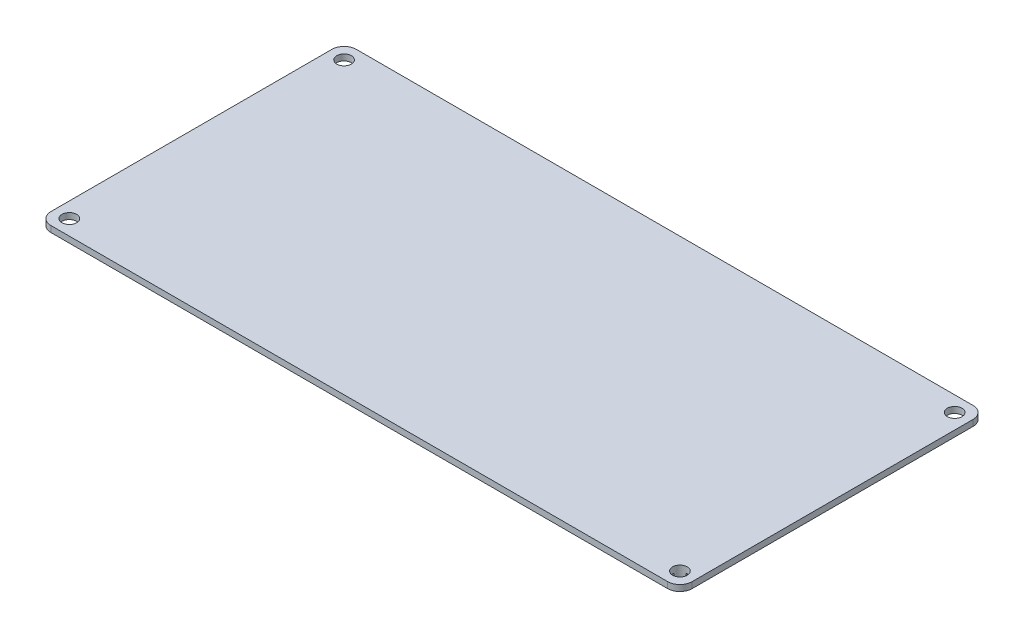
ISO-10303-21;
HEADER;
FILE_DESCRIPTION(('STEP AP214'),'2;1');
FILE_NAME('part.step','',(''),(''),'','','');
FILE_SCHEMA(('AUTOMOTIVE_DESIGN { 1 0 10303 214 1 1 1 1 }'));
ENDSEC;
DATA;
#1=APPLICATION_CONTEXT('core data for automotive mechanical design processes');
#2=APPLICATION_PROTOCOL_DEFINITION('international standard','automotive_design',2000,#1);
#3=PRODUCT_CONTEXT('',#1,'mechanical');
#4=PRODUCT('Part','Part','',(#3));
#5=PRODUCT_RELATED_PRODUCT_CATEGORY('part','',(#4));
#6=PRODUCT_DEFINITION_FORMATION('','',#4);
#7=PRODUCT_DEFINITION_CONTEXT('part definition',#1,'design');
#8=PRODUCT_DEFINITION('design','',#6,#7);
#9=PRODUCT_DEFINITION_SHAPE('','',#8);
#10=(LENGTH_UNIT() NAMED_UNIT(*) SI_UNIT(.MILLI.,.METRE.));
#11=(NAMED_UNIT(*) PLANE_ANGLE_UNIT() SI_UNIT($,.RADIAN.));
#12=(NAMED_UNIT(*) SI_UNIT($,.STERADIAN.) SOLID_ANGLE_UNIT());
#13=UNCERTAINTY_MEASURE_WITH_UNIT(LENGTH_MEASURE(1.E-05),#10,'distance_accuracy_value','');
#14=(GEOMETRIC_REPRESENTATION_CONTEXT(3) GLOBAL_UNCERTAINTY_ASSIGNED_CONTEXT((#13)) GLOBAL_UNIT_ASSIGNED_CONTEXT((#10,
#11,#12)) REPRESENTATION_CONTEXT('',''));
#15=CARTESIAN_POINT('',(0.,0.,0.));
#16=DIRECTION('',(0.,0.,1.));
#17=DIRECTION('',(1.,0.,0.));
#18=AXIS2_PLACEMENT_3D('',#15,#16,#17);
#19=CARTESIAN_POINT('',(0.,0.,0.));
#20=DIRECTION('',(0.,1.,0.));
#21=DIRECTION('',(0.,0.,1.));
#22=AXIS2_PLACEMENT_3D('',#19,#20,#21);
#23=PLANE('',#22);
#24=DIRECTION('',(0.,0.,1.));
#25=VECTOR('',#24,1.);
#26=CARTESIAN_POINT('',(63.2714,0.,28.3464));
#27=LINE('',#26,#25);
#28=CARTESIAN_POINT('',(63.2714,0.,-27.0682425410837));
#29=VERTEX_POINT('',#28);
#30=CARTESIAN_POINT('',(63.2714,0.,27.0682425410837));
#31=VERTEX_POINT('',#30);
#32=EDGE_CURVE('E321',#29,#31,#27,.T.);
#33=ORIENTED_EDGE('',*,*,#32,.T.);
#34=CARTESIAN_POINT('',(63.5,0.,28.575));
#35=DIRECTION('',(0.,-1.,0.));
#36=DIRECTION('',(0.,0.,-1.));
#37=AXIS2_PLACEMENT_3D('',#34,#35,#36);
#38=CIRCLE('',#37,1.524);
#39=CARTESIAN_POINT('',(61.9932425410837,0.,28.3464));
#40=VERTEX_POINT('',#39);
#41=EDGE_CURVE('E198',#40,#31,#38,.T.);
#42=ORIENTED_EDGE('',*,*,#41,.F.);
#43=DIRECTION('',(-1.,0.,0.));
#44=VECTOR('',#43,1.);
#45=CARTESIAN_POINT('',(-63.2714,0.,28.3464));
#46=LINE('',#45,#44);
#47=CARTESIAN_POINT('',(-61.9932425410837,0.,28.3464));
#48=VERTEX_POINT('',#47);
#49=EDGE_CURVE('E171',#40,#48,#46,.T.);
#50=ORIENTED_EDGE('',*,*,#49,.T.);
#51=CARTESIAN_POINT('',(-63.5,0.,28.575));
#52=DIRECTION('',(0.,-1.,0.));
#53=DIRECTION('',(0.,0.,-1.));
#54=AXIS2_PLACEMENT_3D('',#51,#52,#53);
#55=CIRCLE('',#54,1.52399999999999);
#56=CARTESIAN_POINT('',(-63.2714,0.,27.0682425410837));
#57=VERTEX_POINT('',#56);
#58=EDGE_CURVE('E197',#57,#48,#55,.T.);
#59=ORIENTED_EDGE('',*,*,#58,.F.);
#60=DIRECTION('',(0.,0.,-1.));
#61=VECTOR('',#60,1.);
#62=CARTESIAN_POINT('',(-63.2714,0.,28.3464));
#63=LINE('',#62,#61);
#64=CARTESIAN_POINT('',(-63.2714,0.,-27.0682425410837));
#65=VERTEX_POINT('',#64);
#66=EDGE_CURVE('E328',#57,#65,#63,.T.);
#67=ORIENTED_EDGE('',*,*,#66,.T.);
#68=CARTESIAN_POINT('',(-63.5,0.,-28.575));
#69=DIRECTION('',(0.,-1.,0.));
#70=DIRECTION('',(0.,0.,-1.));
#71=AXIS2_PLACEMENT_3D('',#68,#69,#70);
#72=CIRCLE('',#71,1.52399999999999);
#73=CARTESIAN_POINT('',(-61.9932425410837,0.,-28.3464));
#74=VERTEX_POINT('',#73);
#75=EDGE_CURVE('E192',#74,#65,#72,.T.);
#76=ORIENTED_EDGE('',*,*,#75,.F.);
#77=DIRECTION('',(1.,0.,0.));
#78=VECTOR('',#77,1.);
#79=CARTESIAN_POINT('',(-63.2714,0.,-28.3464));
#80=LINE('',#79,#78);
#81=CARTESIAN_POINT('',(61.9932425410837,0.,-28.3464));
#82=VERTEX_POINT('',#81);
#83=EDGE_CURVE('E325',#74,#82,#80,.T.);
#84=ORIENTED_EDGE('',*,*,#83,.T.);
#85=CARTESIAN_POINT('',(63.5,0.,-28.575));
#86=DIRECTION('',(0.,-1.,0.));
#87=DIRECTION('',(0.,0.,-1.));
#88=AXIS2_PLACEMENT_3D('',#85,#86,#87);
#89=CIRCLE('',#88,1.524);
#90=EDGE_CURVE('E176',#29,#82,#89,.T.);
#91=ORIENTED_EDGE('',*,*,#90,.F.);
#92=EDGE_LOOP('',(#33,#42,#50,#59,#67,#76,#84,#91));
#93=FACE_BOUND('',#92,.T.);
#94=ADVANCED_FACE('F39',(#93),#23,.F.);
#95=CARTESIAN_POINT('',(-63.5,2.54,28.575));
#96=DIRECTION('',(0.,-1.,0.));
#97=DIRECTION('',(0.,0.,-1.));
#98=AXIS2_PLACEMENT_3D('',#95,#96,#97);
#99=CYLINDRICAL_SURFACE('',#98,1.52399999999999);
#100=CARTESIAN_POINT('',(-63.5,2.54,28.575));
#101=DIRECTION('',(0.,-1.,0.));
#102=DIRECTION('',(0.,0.,-1.));
#103=AXIS2_PLACEMENT_3D('',#100,#101,#102);
#104=CIRCLE('',#103,1.52399999999999);
#105=CARTESIAN_POINT('',(-63.5,2.54,27.051));
#106=VERTEX_POINT('',#105);
#107=EDGE_CURVE('E215',#106,#106,#104,.T.);
#108=ORIENTED_EDGE('',*,*,#107,.F.);
#109=EDGE_LOOP('',(#108));
#110=FACE_BOUND('',#109,.T.);
#111=DIRECTION('',(0.,-1.,0.));
#112=VECTOR('',#111,1.);
#113=CARTESIAN_POINT('',(-63.2714,2.54,27.0682425410837));
#114=LINE('',#113,#112);
#115=CARTESIAN_POINT('',(-63.2714,1.27,27.0682425410837));
#116=VERTEX_POINT('',#115);
#117=EDGE_CURVE('E179',#57,#116,#114,.F.);
#118=ORIENTED_EDGE('',*,*,#117,.F.);
#119=ORIENTED_EDGE('',*,*,#58,.T.);
#120=DIRECTION('',(0.,-1.,0.));
#121=VECTOR('',#120,1.);
#122=CARTESIAN_POINT('',(-61.9932425410837,2.54,28.3464));
#123=LINE('',#122,#121);
#124=CARTESIAN_POINT('',(-61.9932425410837,1.27,28.3464));
#125=VERTEX_POINT('',#124);
#126=EDGE_CURVE('E183',#125,#48,#123,.T.);
#127=ORIENTED_EDGE('',*,*,#126,.F.);
#128=CARTESIAN_POINT('',(-63.5,1.27,28.575));
#129=DIRECTION('',(0.,1.,0.));
#130=DIRECTION('',(0.,0.,1.));
#131=AXIS2_PLACEMENT_3D('',#128,#129,#130);
#132=CIRCLE('',#131,1.52399999999999);
#133=EDGE_CURVE('E219',#116,#125,#132,.T.);
#134=ORIENTED_EDGE('',*,*,#133,.F.);
#135=EDGE_LOOP('',(#118,#119,#127,#134));
#136=FACE_BOUND('',#135,.T.);
#137=ADVANCED_FACE('F350',(#110,#136),#99,.F.);
#138=CARTESIAN_POINT('',(63.5,2.54,28.575));
#139=DIRECTION('',(0.,-1.,0.));
#140=DIRECTION('',(0.,0.,-1.));
#141=AXIS2_PLACEMENT_3D('',#138,#139,#140);
#142=CYLINDRICAL_SURFACE('',#141,1.524);
#143=CARTESIAN_POINT('',(63.5,2.54,28.575));
#144=DIRECTION('',(0.,-1.,0.));
#145=DIRECTION('',(0.,0.,-1.));
#146=AXIS2_PLACEMENT_3D('',#143,#144,#145);
#147=CIRCLE('',#146,1.524);
#148=CARTESIAN_POINT('',(63.5,2.54,27.051));
#149=VERTEX_POINT('',#148);
#150=EDGE_CURVE('E193',#149,#149,#147,.T.);
#151=ORIENTED_EDGE('',*,*,#150,.F.);
#152=EDGE_LOOP('',(#151));
#153=FACE_BOUND('',#152,.T.);
#154=DIRECTION('',(0.,-1.,0.));
#155=VECTOR('',#154,1.);
#156=CARTESIAN_POINT('',(61.9932425410837,2.54,28.3464));
#157=LINE('',#156,#155);
#158=CARTESIAN_POINT('',(61.9932425410837,1.27,28.3464));
#159=VERTEX_POINT('',#158);
#160=EDGE_CURVE('E11',#40,#159,#157,.F.);
#161=ORIENTED_EDGE('',*,*,#160,.F.);
#162=ORIENTED_EDGE('',*,*,#41,.T.);
#163=DIRECTION('',(0.,-1.,0.));
#164=VECTOR('',#163,1.);
#165=CARTESIAN_POINT('',(63.2714,2.54,27.0682425410837));
#166=LINE('',#165,#164);
#167=CARTESIAN_POINT('',(63.2714,1.27,27.0682425410837));
#168=VERTEX_POINT('',#167);
#169=EDGE_CURVE('E178',#168,#31,#166,.T.);
#170=ORIENTED_EDGE('',*,*,#169,.F.);
#171=CARTESIAN_POINT('',(63.5,1.27,28.575));
#172=DIRECTION('',(0.,1.,0.));
#173=DIRECTION('',(0.,0.,1.));
#174=AXIS2_PLACEMENT_3D('',#171,#172,#173);
#175=CIRCLE('',#174,1.524);
#176=EDGE_CURVE('E55',#159,#168,#175,.T.);
#177=ORIENTED_EDGE('',*,*,#176,.F.);
#178=EDGE_LOOP('',(#161,#162,#170,#177));
#179=FACE_BOUND('',#178,.T.);
#180=ADVANCED_FACE('F352',(#153,#179),#142,.F.);
#181=CARTESIAN_POINT('',(63.5,2.54,-28.575));
#182=DIRECTION('',(0.,-1.,0.));
#183=DIRECTION('',(0.,0.,-1.));
#184=AXIS2_PLACEMENT_3D('',#181,#182,#183);
#185=CYLINDRICAL_SURFACE('',#184,1.524);
#186=CARTESIAN_POINT('',(63.5,2.54,-28.575));
#187=DIRECTION('',(0.,-1.,0.));
#188=DIRECTION('',(0.,0.,-1.));
#189=AXIS2_PLACEMENT_3D('',#186,#187,#188);
#190=CIRCLE('',#189,1.524);
#191=CARTESIAN_POINT('',(63.5,2.54,-30.099));
#192=VERTEX_POINT('',#191);
#193=EDGE_CURVE('E202',#192,#192,#190,.T.);
#194=ORIENTED_EDGE('',*,*,#193,.F.);
#195=EDGE_LOOP('',(#194));
#196=FACE_BOUND('',#195,.T.);
#197=DIRECTION('',(0.,-1.,0.));
#198=VECTOR('',#197,1.);
#199=CARTESIAN_POINT('',(63.2714,2.54,-27.0682425410837));
#200=LINE('',#199,#198);
#201=CARTESIAN_POINT('',(63.2714,1.27,-27.0682425410837));
#202=VERTEX_POINT('',#201);
#203=EDGE_CURVE('E48',#29,#202,#200,.F.);
#204=ORIENTED_EDGE('',*,*,#203,.F.);
#205=ORIENTED_EDGE('',*,*,#90,.T.);
#206=DIRECTION('',(0.,-1.,0.));
#207=VECTOR('',#206,1.);
#208=CARTESIAN_POINT('',(61.9932425410837,2.54,-28.3464));
#209=LINE('',#208,#207);
#210=CARTESIAN_POINT('',(61.9932425410837,1.27,-28.3464));
#211=VERTEX_POINT('',#210);
#212=EDGE_CURVE('E166',#211,#82,#209,.T.);
#213=ORIENTED_EDGE('',*,*,#212,.F.);
#214=CARTESIAN_POINT('',(63.5,1.27,-28.575));
#215=DIRECTION('',(0.,1.,0.));
#216=DIRECTION('',(0.,0.,1.));
#217=AXIS2_PLACEMENT_3D('',#214,#215,#216);
#218=CIRCLE('',#217,1.524);
#219=EDGE_CURVE('E63',#202,#211,#218,.T.);
#220=ORIENTED_EDGE('',*,*,#219,.F.);
#221=EDGE_LOOP('',(#204,#205,#213,#220));
#222=FACE_BOUND('',#221,.T.);
#223=ADVANCED_FACE('F174',(#196,#222),#185,.F.);
#224=CARTESIAN_POINT('',(-63.5,2.54,-28.575));
#225=DIRECTION('',(0.,-1.,0.));
#226=DIRECTION('',(0.,0.,-1.));
#227=AXIS2_PLACEMENT_3D('',#224,#225,#226);
#228=CYLINDRICAL_SURFACE('',#227,1.52399999999999);
#229=CARTESIAN_POINT('',(-63.5,2.54,-28.575));
#230=DIRECTION('',(0.,-1.,0.));
#231=DIRECTION('',(0.,0.,-1.));
#232=AXIS2_PLACEMENT_3D('',#229,#230,#231);
#233=CIRCLE('',#232,1.52399999999999);
#234=CARTESIAN_POINT('',(-63.5,2.54,-30.099));
#235=VERTEX_POINT('',#234);
#236=EDGE_CURVE('E208',#235,#235,#233,.T.);
#237=ORIENTED_EDGE('',*,*,#236,.F.);
#238=EDGE_LOOP('',(#237));
#239=FACE_BOUND('',#238,.T.);
#240=DIRECTION('',(0.,-1.,0.));
#241=VECTOR('',#240,1.);
#242=CARTESIAN_POINT('',(-61.9932425410837,2.54,-28.3464));
#243=LINE('',#242,#241);
#244=CARTESIAN_POINT('',(-61.9932425410837,1.27,-28.3464));
#245=VERTEX_POINT('',#244);
#246=EDGE_CURVE('E169',#74,#245,#243,.F.);
#247=ORIENTED_EDGE('',*,*,#246,.F.);
#248=ORIENTED_EDGE('',*,*,#75,.T.);
#249=DIRECTION('',(0.,-1.,0.));
#250=VECTOR('',#249,1.);
#251=CARTESIAN_POINT('',(-63.2714,2.54,-27.0682425410837));
#252=LINE('',#251,#250);
#253=CARTESIAN_POINT('',(-63.2714,1.27,-27.0682425410837));
#254=VERTEX_POINT('',#253);
#255=EDGE_CURVE('E313',#254,#65,#252,.T.);
#256=ORIENTED_EDGE('',*,*,#255,.F.);
#257=CARTESIAN_POINT('',(-63.5,1.27,-28.575));
#258=DIRECTION('',(0.,1.,0.));
#259=DIRECTION('',(0.,0.,1.));
#260=AXIS2_PLACEMENT_3D('',#257,#258,#259);
#261=CIRCLE('',#260,1.52399999999999);
#262=EDGE_CURVE('E162',#245,#254,#261,.T.);
#263=ORIENTED_EDGE('',*,*,#262,.F.);
#264=EDGE_LOOP('',(#247,#248,#256,#263));
#265=FACE_BOUND('',#264,.T.);
#266=ADVANCED_FACE('F360',(#239,#265),#228,.F.);
#267=CARTESIAN_POINT('',(0.,1.27,0.));
#268=DIRECTION('',(0.,1.,0.));
#269=DIRECTION('',(0.,0.,1.));
#270=AXIS2_PLACEMENT_3D('',#267,#268,#269);
#271=PLANE('',#270);
#272=DIRECTION('',(1.,0.,0.));
#273=VECTOR('',#272,1.);
#274=CARTESIAN_POINT('',(-66.675,1.27,31.75));
#275=LINE('',#274,#273);
#276=CARTESIAN_POINT('',(-64.135,1.27,31.75));
#277=VERTEX_POINT('',#276);
#278=CARTESIAN_POINT('',(64.135,1.27,31.75));
#279=VERTEX_POINT('',#278);
#280=EDGE_CURVE('E235',#277,#279,#275,.T.);
#281=ORIENTED_EDGE('',*,*,#280,.F.);
#282=CARTESIAN_POINT('',(-64.135,1.27,29.21));
#283=DIRECTION('',(0.,1.,0.));
#284=DIRECTION('',(0.,0.,1.));
#285=AXIS2_PLACEMENT_3D('',#282,#283,#284);
#286=CIRCLE('',#285,2.54);
#287=CARTESIAN_POINT('',(-66.675,1.27,29.21));
#288=VERTEX_POINT('',#287);
#289=EDGE_CURVE('E277',#277,#288,#286,.F.);
#290=ORIENTED_EDGE('',*,*,#289,.T.);
#291=DIRECTION('',(0.,0.,1.));
#292=VECTOR('',#291,1.);
#293=CARTESIAN_POINT('',(-66.675,1.27,-31.75));
#294=LINE('',#293,#292);
#295=CARTESIAN_POINT('',(-66.675,1.27,-29.21));
#296=VERTEX_POINT('',#295);
#297=EDGE_CURVE('E255',#296,#288,#294,.T.);
#298=ORIENTED_EDGE('',*,*,#297,.F.);
#299=CARTESIAN_POINT('',(-64.135,1.27,-29.21));
#300=DIRECTION('',(0.,1.,0.));
#301=DIRECTION('',(0.,0.,1.));
#302=AXIS2_PLACEMENT_3D('',#299,#300,#301);
#303=CIRCLE('',#302,2.54);
#304=CARTESIAN_POINT('',(-64.135,1.27,-31.75));
#305=VERTEX_POINT('',#304);
#306=EDGE_CURVE('E274',#296,#305,#303,.F.);
#307=ORIENTED_EDGE('',*,*,#306,.T.);
#308=DIRECTION('',(-1.,0.,0.));
#309=VECTOR('',#308,1.);
#310=CARTESIAN_POINT('',(-66.675,1.27,-31.75));
#311=LINE('',#310,#309);
#312=CARTESIAN_POINT('',(64.135,1.27,-31.75));
#313=VERTEX_POINT('',#312);
#314=EDGE_CURVE('E251',#313,#305,#311,.T.);
#315=ORIENTED_EDGE('',*,*,#314,.F.);
#316=CARTESIAN_POINT('',(64.135,1.27,-29.21));
#317=DIRECTION('',(0.,1.,0.));
#318=DIRECTION('',(0.,0.,1.));
#319=AXIS2_PLACEMENT_3D('',#316,#317,#318);
#320=CIRCLE('',#319,2.54);
#321=CARTESIAN_POINT('',(66.675,1.27,-29.21));
#322=VERTEX_POINT('',#321);
#323=EDGE_CURVE('E271',#313,#322,#320,.F.);
#324=ORIENTED_EDGE('',*,*,#323,.T.);
#325=DIRECTION('',(0.,0.,-1.));
#326=VECTOR('',#325,1.);
#327=CARTESIAN_POINT('',(66.675,1.27,-31.75));
#328=LINE('',#327,#326);
#329=CARTESIAN_POINT('',(66.675,1.27,29.21));
#330=VERTEX_POINT('',#329);
#331=EDGE_CURVE('E229',#330,#322,#328,.T.);
#332=ORIENTED_EDGE('',*,*,#331,.F.);
#333=CARTESIAN_POINT('',(64.135,1.27,29.21));
#334=DIRECTION('',(0.,1.,0.));
#335=DIRECTION('',(0.,0.,1.));
#336=AXIS2_PLACEMENT_3D('',#333,#334,#335);
#337=CIRCLE('',#336,2.54);
#338=EDGE_CURVE('E268',#330,#279,#337,.F.);
#339=ORIENTED_EDGE('',*,*,#338,.T.);
#340=EDGE_LOOP('',(#281,#290,#298,#307,#315,#324,#332,#339));
#341=FACE_BOUND('',#340,.T.);
#342=ORIENTED_EDGE('',*,*,#219,.T.);
#343=DIRECTION('',(1.,0.,0.));
#344=VECTOR('',#343,1.);
#345=CARTESIAN_POINT('',(-63.2714,1.26999999999999,-28.3464));
#346=LINE('',#345,#344);
#347=EDGE_CURVE('E156',#245,#211,#346,.T.);
#348=ORIENTED_EDGE('',*,*,#347,.F.);
#349=ORIENTED_EDGE('',*,*,#262,.T.);
#350=DIRECTION('',(0.,0.,-1.));
#351=VECTOR('',#350,1.);
#352=CARTESIAN_POINT('',(-63.2714,1.26999999999999,28.3464));
#353=LINE('',#352,#351);
#354=EDGE_CURVE('E186',#116,#254,#353,.T.);
#355=ORIENTED_EDGE('',*,*,#354,.F.);
#356=ORIENTED_EDGE('',*,*,#133,.T.);
#357=DIRECTION('',(-1.,0.,0.));
#358=VECTOR('',#357,1.);
#359=CARTESIAN_POINT('',(-63.2714,1.26999999999999,28.3464));
#360=LINE('',#359,#358);
#361=EDGE_CURVE('E339',#159,#125,#360,.T.);
#362=ORIENTED_EDGE('',*,*,#361,.F.);
#363=ORIENTED_EDGE('',*,*,#176,.T.);
#364=DIRECTION('',(0.,0.,1.));
#365=VECTOR('',#364,1.);
#366=CARTESIAN_POINT('',(63.2714,1.26999999999999,28.3464));
#367=LINE('',#366,#365);
#368=EDGE_CURVE('E159',#202,#168,#367,.T.);
#369=ORIENTED_EDGE('',*,*,#368,.F.);
#370=EDGE_LOOP('',(#342,#348,#349,#355,#356,#362,#363,#369));
#371=FACE_BOUND('',#370,.T.);
#372=ADVANCED_FACE('F155',(#341,#371),#271,.F.);
#373=CARTESIAN_POINT('',(66.675,2.54,-31.75));
#374=DIRECTION('',(-1.,0.,0.));
#375=DIRECTION('',(0.,0.,1.));
#376=AXIS2_PLACEMENT_3D('',#373,#374,#375);
#377=PLANE('',#376);
#378=ORIENTED_EDGE('',*,*,#331,.T.);
#379=DIRECTION('',(0.,-1.,0.));
#380=VECTOR('',#379,1.);
#381=CARTESIAN_POINT('',(66.675,2.54,-29.21));
#382=LINE('',#381,#380);
#383=CARTESIAN_POINT('',(66.675,2.54,-29.21));
#384=VERTEX_POINT('',#383);
#385=EDGE_CURVE('E310',#322,#384,#382,.F.);
#386=ORIENTED_EDGE('',*,*,#385,.T.);
#387=DIRECTION('',(0.,0.,-1.));
#388=VECTOR('',#387,1.);
#389=CARTESIAN_POINT('',(66.675,2.54,-31.75));
#390=LINE('',#389,#388);
#391=CARTESIAN_POINT('',(66.675,2.54,29.21));
#392=VERTEX_POINT('',#391);
#393=EDGE_CURVE('E230',#392,#384,#390,.T.);
#394=ORIENTED_EDGE('',*,*,#393,.F.);
#395=DIRECTION('',(0.,-1.,0.));
#396=VECTOR('',#395,1.);
#397=CARTESIAN_POINT('',(66.675,2.54,29.21));
#398=LINE('',#397,#396);
#399=EDGE_CURVE('E306',#392,#330,#398,.T.);
#400=ORIENTED_EDGE('',*,*,#399,.T.);
#401=EDGE_LOOP('',(#378,#386,#394,#400));
#402=FACE_BOUND('',#401,.T.);
#403=ADVANCED_FACE('F373',(#402),#377,.F.);
#404=CARTESIAN_POINT('',(-66.675,2.54,-31.75));
#405=DIRECTION('',(0.,0.,1.));
#406=DIRECTION('',(1.,0.,0.));
#407=AXIS2_PLACEMENT_3D('',#404,#405,#406);
#408=PLANE('',#407);
#409=ORIENTED_EDGE('',*,*,#314,.T.);
#410=DIRECTION('',(0.,-1.,0.));
#411=VECTOR('',#410,1.);
#412=CARTESIAN_POINT('',(-64.135,2.54,-31.75));
#413=LINE('',#412,#411);
#414=CARTESIAN_POINT('',(-64.135,2.54,-31.75));
#415=VERTEX_POINT('',#414);
#416=EDGE_CURVE('E303',#305,#415,#413,.F.);
#417=ORIENTED_EDGE('',*,*,#416,.T.);
#418=DIRECTION('',(-1.,0.,0.));
#419=VECTOR('',#418,1.);
#420=CARTESIAN_POINT('',(-66.675,2.54,-31.75));
#421=LINE('',#420,#419);
#422=CARTESIAN_POINT('',(64.135,2.54,-31.75));
#423=VERTEX_POINT('',#422);
#424=EDGE_CURVE('E234',#423,#415,#421,.T.);
#425=ORIENTED_EDGE('',*,*,#424,.F.);
#426=DIRECTION('',(0.,-1.,0.));
#427=VECTOR('',#426,1.);
#428=CARTESIAN_POINT('',(64.135,2.54,-31.75));
#429=LINE('',#428,#427);
#430=EDGE_CURVE('E299',#423,#313,#429,.T.);
#431=ORIENTED_EDGE('',*,*,#430,.T.);
#432=EDGE_LOOP('',(#409,#417,#425,#431));
#433=FACE_BOUND('',#432,.T.);
#434=ADVANCED_FACE('F399',(#433),#408,.F.);
#435=CARTESIAN_POINT('',(-66.675,2.54,-31.75));
#436=DIRECTION('',(1.,0.,0.));
#437=DIRECTION('',(0.,0.,-1.));
#438=AXIS2_PLACEMENT_3D('',#435,#436,#437);
#439=PLANE('',#438);
#440=ORIENTED_EDGE('',*,*,#297,.T.);
#441=DIRECTION('',(0.,-1.,0.));
#442=VECTOR('',#441,1.);
#443=CARTESIAN_POINT('',(-66.675,2.54,29.21));
#444=LINE('',#443,#442);
#445=CARTESIAN_POINT('',(-66.675,2.54,29.21));
#446=VERTEX_POINT('',#445);
#447=EDGE_CURVE('E284',#288,#446,#444,.F.);
#448=ORIENTED_EDGE('',*,*,#447,.T.);
#449=DIRECTION('',(0.,0.,1.));
#450=VECTOR('',#449,1.);
#451=CARTESIAN_POINT('',(-66.675,2.54,-31.75));
#452=LINE('',#451,#450);
#453=CARTESIAN_POINT('',(-66.675,2.54,-29.21));
#454=VERTEX_POINT('',#453);
#455=EDGE_CURVE('E239',#454,#446,#452,.T.);
#456=ORIENTED_EDGE('',*,*,#455,.F.);
#457=DIRECTION('',(0.,-1.,0.));
#458=VECTOR('',#457,1.);
#459=CARTESIAN_POINT('',(-66.675,2.54,-29.21));
#460=LINE('',#459,#458);
#461=EDGE_CURVE('E280',#454,#296,#460,.T.);
#462=ORIENTED_EDGE('',*,*,#461,.T.);
#463=EDGE_LOOP('',(#440,#448,#456,#462));
#464=FACE_BOUND('',#463,.T.);
#465=ADVANCED_FACE('F406',(#464),#439,.F.);
#466=CARTESIAN_POINT('',(-66.675,2.54,31.75));
#467=DIRECTION('',(0.,0.,-1.));
#468=DIRECTION('',(-1.,0.,0.));
#469=AXIS2_PLACEMENT_3D('',#466,#467,#468);
#470=PLANE('',#469);
#471=DIRECTION('',(1.,0.,0.));
#472=VECTOR('',#471,1.);
#473=CARTESIAN_POINT('',(-66.675,2.54,31.75));
#474=LINE('',#473,#472);
#475=CARTESIAN_POINT('',(-64.135,2.54,31.75));
#476=VERTEX_POINT('',#475);
#477=CARTESIAN_POINT('',(64.135,2.54,31.75));
#478=VERTEX_POINT('',#477);
#479=EDGE_CURVE('E243',#476,#478,#474,.T.);
#480=ORIENTED_EDGE('',*,*,#479,.F.);
#481=DIRECTION('',(0.,-1.,0.));
#482=VECTOR('',#481,1.);
#483=CARTESIAN_POINT('',(-64.135,2.54,31.75));
#484=LINE('',#483,#482);
#485=EDGE_CURVE('E264',#476,#277,#484,.T.);
#486=ORIENTED_EDGE('',*,*,#485,.T.);
#487=ORIENTED_EDGE('',*,*,#280,.T.);
#488=DIRECTION('',(0.,-1.,0.));
#489=VECTOR('',#488,1.);
#490=CARTESIAN_POINT('',(64.135,2.54,31.75));
#491=LINE('',#490,#489);
#492=EDGE_CURVE('E247',#279,#478,#491,.F.);
#493=ORIENTED_EDGE('',*,*,#492,.T.);
#494=EDGE_LOOP('',(#480,#486,#487,#493));
#495=FACE_BOUND('',#494,.T.);
#496=ADVANCED_FACE('F413',(#495),#470,.F.);
#497=CARTESIAN_POINT('',(0.,2.54,0.));
#498=DIRECTION('',(0.,1.,0.));
#499=DIRECTION('',(0.,0.,1.));
#500=AXIS2_PLACEMENT_3D('',#497,#498,#499);
#501=PLANE('',#500);
#502=ORIENTED_EDGE('',*,*,#236,.T.);
#503=EDGE_LOOP('',(#502));
#504=FACE_BOUND('',#503,.T.);
#505=ORIENTED_EDGE('',*,*,#193,.T.);
#506=EDGE_LOOP('',(#505));
#507=FACE_BOUND('',#506,.T.);
#508=ORIENTED_EDGE('',*,*,#150,.T.);
#509=EDGE_LOOP('',(#508));
#510=FACE_BOUND('',#509,.T.);
#511=ORIENTED_EDGE('',*,*,#107,.T.);
#512=EDGE_LOOP('',(#511));
#513=FACE_BOUND('',#512,.T.);
#514=ORIENTED_EDGE('',*,*,#455,.T.);
#515=CARTESIAN_POINT('',(-64.135,2.54,29.21));
#516=DIRECTION('',(0.,1.,0.));
#517=DIRECTION('',(0.,0.,1.));
#518=AXIS2_PLACEMENT_3D('',#515,#516,#517);
#519=CIRCLE('',#518,2.54);
#520=EDGE_CURVE('E296',#446,#476,#519,.T.);
#521=ORIENTED_EDGE('',*,*,#520,.T.);
#522=ORIENTED_EDGE('',*,*,#479,.T.);
#523=CARTESIAN_POINT('',(64.135,2.54,29.21));
#524=DIRECTION('',(0.,1.,0.));
#525=DIRECTION('',(0.,0.,1.));
#526=AXIS2_PLACEMENT_3D('',#523,#524,#525);
#527=CIRCLE('',#526,2.54);
#528=EDGE_CURVE('E287',#478,#392,#527,.T.);
#529=ORIENTED_EDGE('',*,*,#528,.T.);
#530=ORIENTED_EDGE('',*,*,#393,.T.);
#531=CARTESIAN_POINT('',(64.135,2.54,-29.21));
#532=DIRECTION('',(0.,1.,0.));
#533=DIRECTION('',(0.,0.,1.));
#534=AXIS2_PLACEMENT_3D('',#531,#532,#533);
#535=CIRCLE('',#534,2.54);
#536=EDGE_CURVE('E290',#384,#423,#535,.T.);
#537=ORIENTED_EDGE('',*,*,#536,.T.);
#538=ORIENTED_EDGE('',*,*,#424,.T.);
#539=CARTESIAN_POINT('',(-64.135,2.54,-29.21));
#540=DIRECTION('',(0.,1.,0.));
#541=DIRECTION('',(0.,0.,1.));
#542=AXIS2_PLACEMENT_3D('',#539,#540,#541);
#543=CIRCLE('',#542,2.54);
#544=EDGE_CURVE('E293',#415,#454,#543,.T.);
#545=ORIENTED_EDGE('',*,*,#544,.T.);
#546=EDGE_LOOP('',(#514,#521,#522,#529,#530,#537,#538,#545));
#547=FACE_BOUND('',#546,.T.);
#548=ADVANCED_FACE('F379',(#504,#507,#510,#513,#547),#501,.T.);
#549=CARTESIAN_POINT('',(-64.135,2.54,29.21));
#550=DIRECTION('',(0.,-1.,0.));
#551=DIRECTION('',(0.,0.,-1.));
#552=AXIS2_PLACEMENT_3D('',#549,#550,#551);
#553=CYLINDRICAL_SURFACE('',#552,2.54);
#554=ORIENTED_EDGE('',*,*,#520,.F.);
#555=ORIENTED_EDGE('',*,*,#447,.F.);
#556=ORIENTED_EDGE('',*,*,#289,.F.);
#557=ORIENTED_EDGE('',*,*,#485,.F.);
#558=EDGE_LOOP('',(#554,#555,#556,#557));
#559=FACE_BOUND('',#558,.T.);
#560=ADVANCED_FACE('F375',(#559),#553,.T.);
#561=CARTESIAN_POINT('',(-64.135,2.54,-29.21));
#562=DIRECTION('',(0.,-1.,0.));
#563=DIRECTION('',(0.,0.,-1.));
#564=AXIS2_PLACEMENT_3D('',#561,#562,#563);
#565=CYLINDRICAL_SURFACE('',#564,2.54);
#566=ORIENTED_EDGE('',*,*,#544,.F.);
#567=ORIENTED_EDGE('',*,*,#416,.F.);
#568=ORIENTED_EDGE('',*,*,#306,.F.);
#569=ORIENTED_EDGE('',*,*,#461,.F.);
#570=EDGE_LOOP('',(#566,#567,#568,#569));
#571=FACE_BOUND('',#570,.T.);
#572=ADVANCED_FACE('F378',(#571),#565,.T.);
#573=CARTESIAN_POINT('',(64.135,2.54,-29.21));
#574=DIRECTION('',(0.,-1.,0.));
#575=DIRECTION('',(0.,0.,-1.));
#576=AXIS2_PLACEMENT_3D('',#573,#574,#575);
#577=CYLINDRICAL_SURFACE('',#576,2.54);
#578=ORIENTED_EDGE('',*,*,#536,.F.);
#579=ORIENTED_EDGE('',*,*,#385,.F.);
#580=ORIENTED_EDGE('',*,*,#323,.F.);
#581=ORIENTED_EDGE('',*,*,#430,.F.);
#582=EDGE_LOOP('',(#578,#579,#580,#581));
#583=FACE_BOUND('',#582,.T.);
#584=ADVANCED_FACE('F382',(#583),#577,.T.);
#585=CARTESIAN_POINT('',(64.135,2.54,29.21));
#586=DIRECTION('',(0.,-1.,0.));
#587=DIRECTION('',(0.,0.,-1.));
#588=AXIS2_PLACEMENT_3D('',#585,#586,#587);
#589=CYLINDRICAL_SURFACE('',#588,2.54);
#590=ORIENTED_EDGE('',*,*,#528,.F.);
#591=ORIENTED_EDGE('',*,*,#492,.F.);
#592=ORIENTED_EDGE('',*,*,#338,.F.);
#593=ORIENTED_EDGE('',*,*,#399,.F.);
#594=EDGE_LOOP('',(#590,#591,#592,#593));
#595=FACE_BOUND('',#594,.T.);
#596=ADVANCED_FACE('F41',(#595),#589,.T.);
#597=CARTESIAN_POINT('',(-63.2714,140.536372466579,28.3464));
#598=DIRECTION('',(-1.,0.,0.));
#599=DIRECTION('',(0.,0.,1.));
#600=AXIS2_PLACEMENT_3D('',#597,#598,#599);
#601=PLANE('',#600);
#602=ORIENTED_EDGE('',*,*,#117,.T.);
#603=ORIENTED_EDGE('',*,*,#354,.T.);
#604=ORIENTED_EDGE('',*,*,#255,.T.);
#605=ORIENTED_EDGE('',*,*,#66,.F.);
#606=EDGE_LOOP('',(#602,#603,#604,#605));
#607=FACE_BOUND('',#606,.T.);
#608=ADVANCED_FACE('F389',(#607),#601,.T.);
#609=CARTESIAN_POINT('',(-63.2714,140.536372466579,-28.3464));
#610=DIRECTION('',(0.,0.,-1.));
#611=DIRECTION('',(-1.,0.,0.));
#612=AXIS2_PLACEMENT_3D('',#609,#610,#611);
#613=PLANE('',#612);
#614=ORIENTED_EDGE('',*,*,#212,.T.);
#615=ORIENTED_EDGE('',*,*,#83,.F.);
#616=ORIENTED_EDGE('',*,*,#246,.T.);
#617=ORIENTED_EDGE('',*,*,#347,.T.);
#618=EDGE_LOOP('',(#614,#615,#616,#617));
#619=FACE_BOUND('',#618,.T.);
#620=ADVANCED_FACE('F165',(#619),#613,.T.);
#621=CARTESIAN_POINT('',(63.2714,140.536372466579,28.3464));
#622=DIRECTION('',(1.,0.,0.));
#623=DIRECTION('',(0.,0.,-1.));
#624=AXIS2_PLACEMENT_3D('',#621,#622,#623);
#625=PLANE('',#624);
#626=ORIENTED_EDGE('',*,*,#169,.T.);
#627=ORIENTED_EDGE('',*,*,#32,.F.);
#628=ORIENTED_EDGE('',*,*,#203,.T.);
#629=ORIENTED_EDGE('',*,*,#368,.T.);
#630=EDGE_LOOP('',(#626,#627,#628,#629));
#631=FACE_BOUND('',#630,.T.);
#632=ADVANCED_FACE('F319',(#631),#625,.T.);
#633=CARTESIAN_POINT('',(-63.2714,140.536372466579,28.3464));
#634=DIRECTION('',(0.,0.,1.));
#635=DIRECTION('',(1.,0.,0.));
#636=AXIS2_PLACEMENT_3D('',#633,#634,#635);
#637=PLANE('',#636);
#638=ORIENTED_EDGE('',*,*,#126,.T.);
#639=ORIENTED_EDGE('',*,*,#49,.F.);
#640=ORIENTED_EDGE('',*,*,#160,.T.);
#641=ORIENTED_EDGE('',*,*,#361,.T.);
#642=EDGE_LOOP('',(#638,#639,#640,#641));
#643=FACE_BOUND('',#642,.T.);
#644=ADVANCED_FACE('F347',(#643),#637,.T.);
#645=CLOSED_SHELL('',(#94,#137,#180,#223,#266,#372,#403,#434,#465,#496,#548,#560,#572,#584,#596,
#608,#620,#632,#644));
#646=MANIFOLD_SOLID_BREP('B2',#645);
#647=ADVANCED_BREP_SHAPE_REPRESENTATION('',(#18,#646),#14);
#648=SHAPE_DEFINITION_REPRESENTATION(#9,#647);
ENDSEC;
END-ISO-10303-21;
